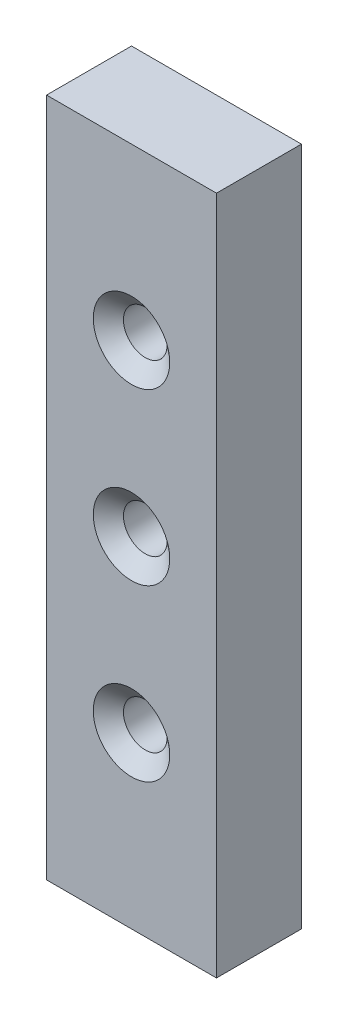
ISO-10303-21;
HEADER;
FILE_DESCRIPTION(('STEP AP214'),'2;1');
FILE_NAME('part.step','',(''),(''),'','','');
FILE_SCHEMA(('AUTOMOTIVE_DESIGN { 1 0 10303 214 1 1 1 1 }'));
ENDSEC;
DATA;
#1=APPLICATION_CONTEXT('core data for automotive mechanical design processes');
#2=APPLICATION_PROTOCOL_DEFINITION('international standard','automotive_design',2000,#1);
#3=PRODUCT_CONTEXT('',#1,'mechanical');
#4=PRODUCT('Part','Part','',(#3));
#5=PRODUCT_RELATED_PRODUCT_CATEGORY('part','',(#4));
#6=PRODUCT_DEFINITION_FORMATION('','',#4);
#7=PRODUCT_DEFINITION_CONTEXT('part definition',#1,'design');
#8=PRODUCT_DEFINITION('design','',#6,#7);
#9=PRODUCT_DEFINITION_SHAPE('','',#8);
#10=(LENGTH_UNIT() NAMED_UNIT(*) SI_UNIT(.MILLI.,.METRE.));
#11=(NAMED_UNIT(*) PLANE_ANGLE_UNIT() SI_UNIT($,.RADIAN.));
#12=(NAMED_UNIT(*) SI_UNIT($,.STERADIAN.) SOLID_ANGLE_UNIT());
#13=UNCERTAINTY_MEASURE_WITH_UNIT(LENGTH_MEASURE(1.E-05),#10,'distance_accuracy_value','');
#14=(GEOMETRIC_REPRESENTATION_CONTEXT(3) GLOBAL_UNCERTAINTY_ASSIGNED_CONTEXT((#13)) GLOBAL_UNIT_ASSIGNED_CONTEXT((#10,
#11,#12)) REPRESENTATION_CONTEXT('',''));
#15=CARTESIAN_POINT('',(0.,0.,0.));
#16=DIRECTION('',(0.,0.,1.));
#17=DIRECTION('',(1.,0.,0.));
#18=AXIS2_PLACEMENT_3D('',#15,#16,#17);
#19=CARTESIAN_POINT('',(-6.35,25.4,3.175));
#20=DIRECTION('',(1.,0.,0.));
#21=DIRECTION('',(0.,1.,0.));
#22=AXIS2_PLACEMENT_3D('',#19,#20,#21);
#23=PLANE('',#22);
#24=DIRECTION('',(0.,-1.,0.));
#25=VECTOR('',#24,1.);
#26=CARTESIAN_POINT('',(-6.35,25.4,-3.175));
#27=LINE('',#26,#25);
#28=CARTESIAN_POINT('',(-6.35,25.4,-3.175));
#29=VERTEX_POINT('',#28);
#30=CARTESIAN_POINT('',(-6.34999999999999,-25.4,-3.175));
#31=VERTEX_POINT('',#30);
#32=EDGE_CURVE('E96',#29,#31,#27,.T.);
#33=ORIENTED_EDGE('',*,*,#32,.T.);
#34=DIRECTION('',(0.,0.,-1.));
#35=VECTOR('',#34,1.);
#36=CARTESIAN_POINT('',(-6.34999999999999,-25.4,3.175));
#37=LINE('',#36,#35);
#38=CARTESIAN_POINT('',(-6.34999999999999,-25.4,3.175));
#39=VERTEX_POINT('',#38);
#40=EDGE_CURVE('E11',#39,#31,#37,.T.);
#41=ORIENTED_EDGE('',*,*,#40,.F.);
#42=DIRECTION('',(0.,-1.,0.));
#43=VECTOR('',#42,1.);
#44=CARTESIAN_POINT('',(-6.35,25.4,3.175));
#45=LINE('',#44,#43);
#46=CARTESIAN_POINT('',(-6.35,25.4,3.175));
#47=VERTEX_POINT('',#46);
#48=EDGE_CURVE('E84',#47,#39,#45,.T.);
#49=ORIENTED_EDGE('',*,*,#48,.F.);
#50=DIRECTION('',(0.,0.,-1.));
#51=VECTOR('',#50,1.);
#52=CARTESIAN_POINT('',(-6.35,25.4,3.175));
#53=LINE('',#52,#51);
#54=EDGE_CURVE('E92',#47,#29,#53,.T.);
#55=ORIENTED_EDGE('',*,*,#54,.T.);
#56=EDGE_LOOP('',(#33,#41,#49,#55));
#57=FACE_BOUND('',#56,.T.);
#58=ADVANCED_FACE('F33',(#57),#23,.F.);
#59=CARTESIAN_POINT('',(-6.34999999999999,-25.4,3.175));
#60=DIRECTION('',(0.,1.,0.));
#61=DIRECTION('',(0.,0.,1.));
#62=AXIS2_PLACEMENT_3D('',#59,#60,#61);
#63=PLANE('',#62);
#64=DIRECTION('',(1.,0.,0.));
#65=VECTOR('',#64,1.);
#66=CARTESIAN_POINT('',(-6.34999999999999,-25.4,-3.175));
#67=LINE('',#66,#65);
#68=CARTESIAN_POINT('',(6.35,-25.4,-3.175));
#69=VERTEX_POINT('',#68);
#70=EDGE_CURVE('E88',#31,#69,#67,.T.);
#71=ORIENTED_EDGE('',*,*,#70,.T.);
#72=DIRECTION('',(0.,0.,-1.));
#73=VECTOR('',#72,1.);
#74=CARTESIAN_POINT('',(6.35,-25.4,3.175));
#75=LINE('',#74,#73);
#76=CARTESIAN_POINT('',(6.35,-25.4,3.175));
#77=VERTEX_POINT('',#76);
#78=EDGE_CURVE('E41',#77,#69,#75,.T.);
#79=ORIENTED_EDGE('',*,*,#78,.F.);
#80=DIRECTION('',(1.,0.,0.));
#81=VECTOR('',#80,1.);
#82=CARTESIAN_POINT('',(-6.34999999999999,-25.4,3.175));
#83=LINE('',#82,#81);
#84=EDGE_CURVE('E79',#39,#77,#83,.T.);
#85=ORIENTED_EDGE('',*,*,#84,.F.);
#86=ORIENTED_EDGE('',*,*,#40,.T.);
#87=EDGE_LOOP('',(#71,#79,#85,#86));
#88=FACE_BOUND('',#87,.T.);
#89=ADVANCED_FACE('F87',(#88),#63,.F.);
#90=CARTESIAN_POINT('',(6.35,25.4,3.175));
#91=DIRECTION('',(-1.,0.,0.));
#92=DIRECTION('',(0.,-1.,0.));
#93=AXIS2_PLACEMENT_3D('',#90,#91,#92);
#94=PLANE('',#93);
#95=DIRECTION('',(0.,1.,0.));
#96=VECTOR('',#95,1.);
#97=CARTESIAN_POINT('',(6.35,25.4,-3.175));
#98=LINE('',#97,#96);
#99=CARTESIAN_POINT('',(6.35,25.4,-3.175));
#100=VERTEX_POINT('',#99);
#101=EDGE_CURVE('E66',#69,#100,#98,.T.);
#102=ORIENTED_EDGE('',*,*,#101,.T.);
#103=DIRECTION('',(0.,0.,-1.));
#104=VECTOR('',#103,1.);
#105=CARTESIAN_POINT('',(6.35,25.4,3.175));
#106=LINE('',#105,#104);
#107=CARTESIAN_POINT('',(6.35,25.4,3.175));
#108=VERTEX_POINT('',#107);
#109=EDGE_CURVE('E89',#108,#100,#106,.T.);
#110=ORIENTED_EDGE('',*,*,#109,.F.);
#111=DIRECTION('',(0.,1.,0.));
#112=VECTOR('',#111,1.);
#113=CARTESIAN_POINT('',(6.35,25.4,3.175));
#114=LINE('',#113,#112);
#115=EDGE_CURVE('E82',#77,#108,#114,.T.);
#116=ORIENTED_EDGE('',*,*,#115,.F.);
#117=ORIENTED_EDGE('',*,*,#78,.T.);
#118=EDGE_LOOP('',(#102,#110,#116,#117));
#119=FACE_BOUND('',#118,.T.);
#120=ADVANCED_FACE('F90',(#119),#94,.F.);
#121=CARTESIAN_POINT('',(-6.35,25.4,3.175));
#122=DIRECTION('',(0.,-1.,0.));
#123=DIRECTION('',(1.,0.,0.));
#124=AXIS2_PLACEMENT_3D('',#121,#122,#123);
#125=PLANE('',#124);
#126=DIRECTION('',(-1.,0.,0.));
#127=VECTOR('',#126,1.);
#128=CARTESIAN_POINT('',(-6.35,25.4,-3.175));
#129=LINE('',#128,#127);
#130=EDGE_CURVE('E72',#100,#29,#129,.T.);
#131=ORIENTED_EDGE('',*,*,#130,.T.);
#132=ORIENTED_EDGE('',*,*,#54,.F.);
#133=DIRECTION('',(-1.,0.,0.));
#134=VECTOR('',#133,1.);
#135=CARTESIAN_POINT('',(-6.35,25.4,3.175));
#136=LINE('',#135,#134);
#137=EDGE_CURVE('E49',#108,#47,#136,.T.);
#138=ORIENTED_EDGE('',*,*,#137,.F.);
#139=ORIENTED_EDGE('',*,*,#109,.T.);
#140=EDGE_LOOP('',(#131,#132,#138,#139));
#141=FACE_BOUND('',#140,.T.);
#142=ADVANCED_FACE('F104',(#141),#125,.F.);
#143=CARTESIAN_POINT('',(0.,0.,3.175));
#144=DIRECTION('',(0.,0.,1.));
#145=DIRECTION('',(1.,0.,0.));
#146=AXIS2_PLACEMENT_3D('',#143,#144,#145);
#147=PLANE('',#146);
#148=CARTESIAN_POINT('',(0.,12.7,3.175));
#149=DIRECTION('',(0.,0.,1.));
#150=DIRECTION('',(1.,0.,0.));
#151=AXIS2_PLACEMENT_3D('',#148,#149,#150);
#152=CIRCLE('',#151,2.8575);
#153=CARTESIAN_POINT('',(2.8575,12.7,3.175));
#154=VERTEX_POINT('',#153);
#155=EDGE_CURVE('E133',#154,#154,#152,.T.);
#156=ORIENTED_EDGE('',*,*,#155,.F.);
#157=EDGE_LOOP('',(#156));
#158=FACE_BOUND('',#157,.T.);
#159=CARTESIAN_POINT('',(0.,0.,3.175));
#160=DIRECTION('',(0.,0.,1.));
#161=DIRECTION('',(1.,0.,0.));
#162=AXIS2_PLACEMENT_3D('',#159,#160,#161);
#163=CIRCLE('',#162,2.8575);
#164=CARTESIAN_POINT('',(2.8575,0.,3.175));
#165=VERTEX_POINT('',#164);
#166=EDGE_CURVE('E124',#165,#165,#163,.T.);
#167=ORIENTED_EDGE('',*,*,#166,.F.);
#168=EDGE_LOOP('',(#167));
#169=FACE_BOUND('',#168,.T.);
#170=CARTESIAN_POINT('',(9.8879238130678E-13,-12.7,3.175));
#171=DIRECTION('',(0.,0.,1.));
#172=DIRECTION('',(1.,0.,0.));
#173=AXIS2_PLACEMENT_3D('',#170,#171,#172);
#174=CIRCLE('',#173,2.8575);
#175=CARTESIAN_POINT('',(2.85750000000099,-12.7,3.175));
#176=VERTEX_POINT('',#175);
#177=EDGE_CURVE('E115',#176,#176,#174,.T.);
#178=ORIENTED_EDGE('',*,*,#177,.F.);
#179=EDGE_LOOP('',(#178));
#180=FACE_BOUND('',#179,.T.);
#181=ORIENTED_EDGE('',*,*,#48,.T.);
#182=ORIENTED_EDGE('',*,*,#84,.T.);
#183=ORIENTED_EDGE('',*,*,#115,.T.);
#184=ORIENTED_EDGE('',*,*,#137,.T.);
#185=EDGE_LOOP('',(#181,#182,#183,#184));
#186=FACE_BOUND('',#185,.T.);
#187=ADVANCED_FACE('F80',(#158,#169,#180,#186),#147,.T.);
#188=CARTESIAN_POINT('',(0.,0.,-3.175));
#189=DIRECTION('',(0.,0.,1.));
#190=DIRECTION('',(1.,0.,0.));
#191=AXIS2_PLACEMENT_3D('',#188,#189,#190);
#192=PLANE('',#191);
#193=CARTESIAN_POINT('',(0.,12.7,-3.175));
#194=DIRECTION('',(0.,0.,1.));
#195=DIRECTION('',(1.,0.,0.));
#196=AXIS2_PLACEMENT_3D('',#193,#194,#195);
#197=CIRCLE('',#196,1.63195);
#198=CARTESIAN_POINT('',(1.63195,12.7,-3.175));
#199=VERTEX_POINT('',#198);
#200=EDGE_CURVE('E127',#199,#199,#197,.T.);
#201=ORIENTED_EDGE('',*,*,#200,.T.);
#202=EDGE_LOOP('',(#201));
#203=FACE_BOUND('',#202,.T.);
#204=CARTESIAN_POINT('',(0.,0.,-3.175));
#205=DIRECTION('',(0.,0.,1.));
#206=DIRECTION('',(1.,0.,0.));
#207=AXIS2_PLACEMENT_3D('',#204,#205,#206);
#208=CIRCLE('',#207,1.63195);
#209=CARTESIAN_POINT('',(1.63195,0.,-3.175));
#210=VERTEX_POINT('',#209);
#211=EDGE_CURVE('E118',#210,#210,#208,.T.);
#212=ORIENTED_EDGE('',*,*,#211,.T.);
#213=EDGE_LOOP('',(#212));
#214=FACE_BOUND('',#213,.T.);
#215=CARTESIAN_POINT('',(9.8879238130678E-13,-12.7,-3.175));
#216=DIRECTION('',(0.,0.,1.));
#217=DIRECTION('',(1.,0.,0.));
#218=AXIS2_PLACEMENT_3D('',#215,#216,#217);
#219=CIRCLE('',#218,1.63195);
#220=CARTESIAN_POINT('',(1.63195000000099,-12.7,-3.175));
#221=VERTEX_POINT('',#220);
#222=EDGE_CURVE('E99',#221,#221,#219,.T.);
#223=ORIENTED_EDGE('',*,*,#222,.T.);
#224=EDGE_LOOP('',(#223));
#225=FACE_BOUND('',#224,.T.);
#226=ORIENTED_EDGE('',*,*,#32,.F.);
#227=ORIENTED_EDGE('',*,*,#130,.F.);
#228=ORIENTED_EDGE('',*,*,#101,.F.);
#229=ORIENTED_EDGE('',*,*,#70,.F.);
#230=EDGE_LOOP('',(#226,#227,#228,#229));
#231=FACE_BOUND('',#230,.T.);
#232=ADVANCED_FACE('F107',(#203,#214,#225,#231),#192,.F.);
#233=CARTESIAN_POINT('',(9.8879238130678E-13,-12.7,3.175));
#234=DIRECTION('',(0.,0.,1.));
#235=DIRECTION('',(1.,0.,0.));
#236=AXIS2_PLACEMENT_3D('',#233,#234,#235);
#237=CYLINDRICAL_SURFACE('',#236,1.63195);
#238=ORIENTED_EDGE('',*,*,#222,.F.);
#239=EDGE_LOOP('',(#238));
#240=FACE_BOUND('',#239,.T.);
#241=CARTESIAN_POINT('',(9.8879238130678E-13,-12.7,2.14664144701068));
#242=DIRECTION('',(0.,0.,1.));
#243=DIRECTION('',(1.,0.,0.));
#244=AXIS2_PLACEMENT_3D('',#241,#242,#243);
#245=CIRCLE('',#244,1.63195);
#246=CARTESIAN_POINT('',(1.63195000000099,-12.7,2.14664144701068));
#247=VERTEX_POINT('',#246);
#248=EDGE_CURVE('E112',#247,#247,#245,.T.);
#249=ORIENTED_EDGE('',*,*,#248,.T.);
#250=EDGE_LOOP('',(#249));
#251=FACE_BOUND('',#250,.T.);
#252=ADVANCED_FACE('F149',(#240,#251),#237,.F.);
#253=CARTESIAN_POINT('',(9.8879238130678E-13,-12.7,3.175));
#254=DIRECTION('',(0.,0.,1.));
#255=DIRECTION('',(1.,0.,0.));
#256=AXIS2_PLACEMENT_3D('',#253,#254,#255);
#257=CONICAL_SURFACE('',#256,2.8575,0.872664625997165);
#258=ORIENTED_EDGE('',*,*,#248,.F.);
#259=EDGE_LOOP('',(#258));
#260=FACE_BOUND('',#259,.T.);
#261=ORIENTED_EDGE('',*,*,#177,.T.);
#262=EDGE_LOOP('',(#261));
#263=FACE_BOUND('',#262,.T.);
#264=ADVANCED_FACE('F146',(#260,#263),#257,.F.);
#265=CARTESIAN_POINT('',(0.,0.,3.175));
#266=DIRECTION('',(0.,0.,1.));
#267=DIRECTION('',(1.,0.,0.));
#268=AXIS2_PLACEMENT_3D('',#265,#266,#267);
#269=CYLINDRICAL_SURFACE('',#268,1.63195);
#270=ORIENTED_EDGE('',*,*,#211,.F.);
#271=EDGE_LOOP('',(#270));
#272=FACE_BOUND('',#271,.T.);
#273=CARTESIAN_POINT('',(0.,0.,2.14664144701068));
#274=DIRECTION('',(0.,0.,1.));
#275=DIRECTION('',(1.,0.,0.));
#276=AXIS2_PLACEMENT_3D('',#273,#274,#275);
#277=CIRCLE('',#276,1.63195);
#278=CARTESIAN_POINT('',(1.63195,0.,2.14664144701068));
#279=VERTEX_POINT('',#278);
#280=EDGE_CURVE('E121',#279,#279,#277,.T.);
#281=ORIENTED_EDGE('',*,*,#280,.T.);
#282=EDGE_LOOP('',(#281));
#283=FACE_BOUND('',#282,.T.);
#284=ADVANCED_FACE('F148',(#272,#283),#269,.F.);
#285=CARTESIAN_POINT('',(0.,0.,3.175));
#286=DIRECTION('',(0.,0.,1.));
#287=DIRECTION('',(1.,0.,0.));
#288=AXIS2_PLACEMENT_3D('',#285,#286,#287);
#289=CONICAL_SURFACE('',#288,2.8575,0.872664625997165);
#290=ORIENTED_EDGE('',*,*,#280,.F.);
#291=EDGE_LOOP('',(#290));
#292=FACE_BOUND('',#291,.T.);
#293=ORIENTED_EDGE('',*,*,#166,.T.);
#294=EDGE_LOOP('',(#293));
#295=FACE_BOUND('',#294,.T.);
#296=ADVANCED_FACE('F156',(#292,#295),#289,.F.);
#297=CARTESIAN_POINT('',(0.,12.7,3.175));
#298=DIRECTION('',(0.,0.,1.));
#299=DIRECTION('',(1.,0.,0.));
#300=AXIS2_PLACEMENT_3D('',#297,#298,#299);
#301=CYLINDRICAL_SURFACE('',#300,1.63195);
#302=ORIENTED_EDGE('',*,*,#200,.F.);
#303=EDGE_LOOP('',(#302));
#304=FACE_BOUND('',#303,.T.);
#305=CARTESIAN_POINT('',(0.,12.7,2.14664144701068));
#306=DIRECTION('',(0.,0.,1.));
#307=DIRECTION('',(1.,0.,0.));
#308=AXIS2_PLACEMENT_3D('',#305,#306,#307);
#309=CIRCLE('',#308,1.63195);
#310=CARTESIAN_POINT('',(1.63195,12.7,2.14664144701068));
#311=VERTEX_POINT('',#310);
#312=EDGE_CURVE('E130',#311,#311,#309,.T.);
#313=ORIENTED_EDGE('',*,*,#312,.T.);
#314=EDGE_LOOP('',(#313));
#315=FACE_BOUND('',#314,.T.);
#316=ADVANCED_FACE('F188',(#304,#315),#301,.F.);
#317=CARTESIAN_POINT('',(0.,12.7,3.175));
#318=DIRECTION('',(0.,0.,1.));
#319=DIRECTION('',(1.,0.,0.));
#320=AXIS2_PLACEMENT_3D('',#317,#318,#319);
#321=CONICAL_SURFACE('',#320,2.8575,0.872664625997165);
#322=ORIENTED_EDGE('',*,*,#312,.F.);
#323=EDGE_LOOP('',(#322));
#324=FACE_BOUND('',#323,.T.);
#325=ORIENTED_EDGE('',*,*,#155,.T.);
#326=EDGE_LOOP('',(#325));
#327=FACE_BOUND('',#326,.T.);
#328=ADVANCED_FACE('F137',(#324,#327),#321,.F.);
#329=CLOSED_SHELL('',(#58,#89,#120,#142,#187,#232,#252,#264,#284,#296,#316,#328));
#330=MANIFOLD_SOLID_BREP('B2',#329);
#331=ADVANCED_BREP_SHAPE_REPRESENTATION('',(#18,#330),#14);
#332=SHAPE_DEFINITION_REPRESENTATION(#9,#331);
ENDSEC;
END-ISO-10303-21;
